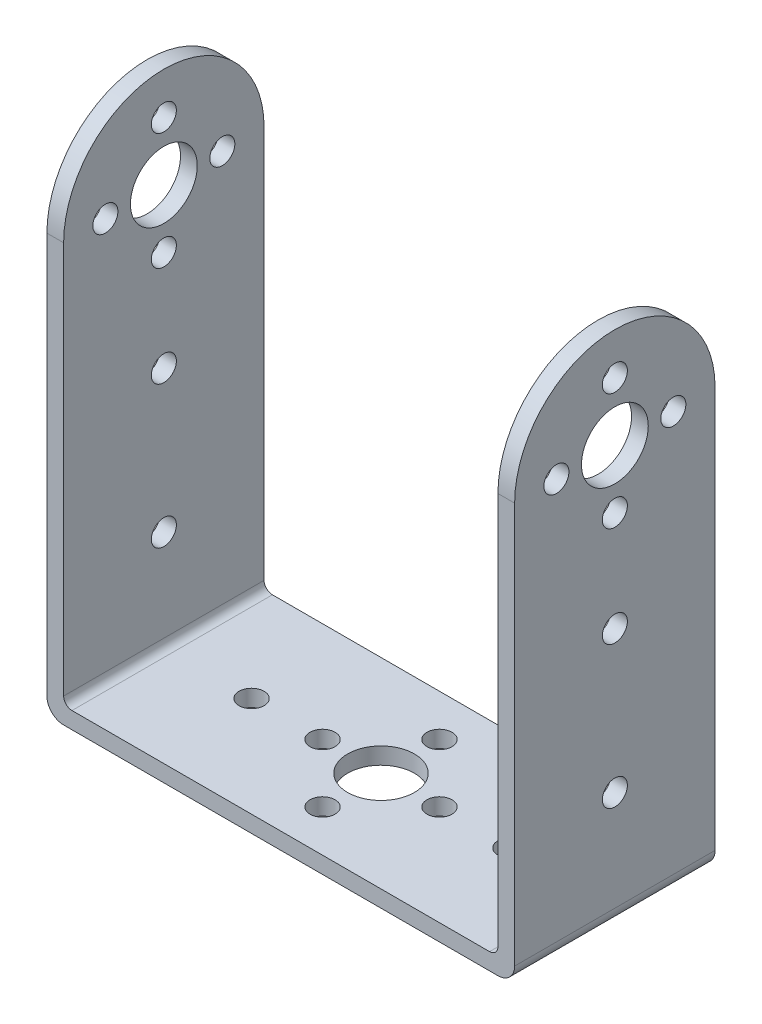
ISO-10303-21;
HEADER;
FILE_DESCRIPTION(('STEP AP214'),'2;1');
FILE_NAME('part.step','',(''),(''),'','','');
FILE_SCHEMA(('AUTOMOTIVE_DESIGN { 1 0 10303 214 1 1 1 1 }'));
ENDSEC;
DATA;
#1=APPLICATION_CONTEXT('core data for automotive mechanical design processes');
#2=APPLICATION_PROTOCOL_DEFINITION('international standard','automotive_design',2000,#1);
#3=PRODUCT_CONTEXT('',#1,'mechanical');
#4=PRODUCT('Part','Part','',(#3));
#5=PRODUCT_RELATED_PRODUCT_CATEGORY('part','',(#4));
#6=PRODUCT_DEFINITION_FORMATION('','',#4);
#7=PRODUCT_DEFINITION_CONTEXT('part definition',#1,'design');
#8=PRODUCT_DEFINITION('design','',#6,#7);
#9=PRODUCT_DEFINITION_SHAPE('','',#8);
#10=(LENGTH_UNIT() NAMED_UNIT(*) SI_UNIT(.MILLI.,.METRE.));
#11=(NAMED_UNIT(*) PLANE_ANGLE_UNIT() SI_UNIT($,.RADIAN.));
#12=(NAMED_UNIT(*) SI_UNIT($,.STERADIAN.) SOLID_ANGLE_UNIT());
#13=UNCERTAINTY_MEASURE_WITH_UNIT(LENGTH_MEASURE(1.E-05),#10,'distance_accuracy_value','');
#14=(GEOMETRIC_REPRESENTATION_CONTEXT(3) GLOBAL_UNCERTAINTY_ASSIGNED_CONTEXT((#13)) GLOBAL_UNIT_ASSIGNED_CONTEXT((#10,
#11,#12)) REPRESENTATION_CONTEXT('',''));
#15=CARTESIAN_POINT('',(0.,0.,0.));
#16=DIRECTION('',(0.,0.,1.));
#17=DIRECTION('',(1.,0.,0.));
#18=AXIS2_PLACEMENT_3D('',#15,#16,#17);
#19=CARTESIAN_POINT('',(0.,2.,0.));
#20=DIRECTION('',(0.,-1.,0.));
#21=DIRECTION('',(0.,0.,-1.));
#22=AXIS2_PLACEMENT_3D('',#19,#20,#21);
#23=PLANE('',#22);
#24=DIRECTION('',(-1.,0.,0.));
#25=VECTOR('',#24,1.);
#26=CARTESIAN_POINT('',(-26.,2.,-12.));
#27=LINE('',#26,#25);
#28=CARTESIAN_POINT('',(25.,2.,-12.));
#29=VERTEX_POINT('',#28);
#30=CARTESIAN_POINT('',(-25.,2.,-12.));
#31=VERTEX_POINT('',#30);
#32=EDGE_CURVE('E263',#29,#31,#27,.T.);
#33=ORIENTED_EDGE('',*,*,#32,.T.);
#34=DIRECTION('',(0.,0.,1.));
#35=VECTOR('',#34,1.);
#36=CARTESIAN_POINT('',(-25.,2.,0.));
#37=LINE('',#36,#35);
#38=CARTESIAN_POINT('',(-25.,2.,12.));
#39=VERTEX_POINT('',#38);
#40=EDGE_CURVE('E299',#31,#39,#37,.T.);
#41=ORIENTED_EDGE('',*,*,#40,.T.);
#42=DIRECTION('',(1.,0.,0.));
#43=VECTOR('',#42,1.);
#44=CARTESIAN_POINT('',(-26.,2.,12.));
#45=LINE('',#44,#43);
#46=CARTESIAN_POINT('',(25.,2.,12.));
#47=VERTEX_POINT('',#46);
#48=EDGE_CURVE('E266',#39,#47,#45,.T.);
#49=ORIENTED_EDGE('',*,*,#48,.T.);
#50=DIRECTION('',(0.,0.,-1.));
#51=VECTOR('',#50,1.);
#52=CARTESIAN_POINT('',(25.,2.,0.));
#53=LINE('',#52,#51);
#54=EDGE_CURVE('E282',#47,#29,#53,.T.);
#55=ORIENTED_EDGE('',*,*,#54,.T.);
#56=EDGE_LOOP('',(#33,#41,#49,#55));
#57=FACE_BOUND('',#56,.T.);
#58=CARTESIAN_POINT('',(0.,2.,0.));
#59=DIRECTION('',(0.,1.,0.));
#60=DIRECTION('',(0.,0.,1.));
#61=AXIS2_PLACEMENT_3D('',#58,#59,#60);
#62=CIRCLE('',#61,4.);
#63=CARTESIAN_POINT('',(0.,2.,4.));
#64=VERTEX_POINT('',#63);
#65=EDGE_CURVE('E257',#64,#64,#62,.T.);
#66=ORIENTED_EDGE('',*,*,#65,.F.);
#67=EDGE_LOOP('',(#66));
#68=FACE_BOUND('',#67,.T.);
#69=CARTESIAN_POINT('',(0.,2.,-7.));
#70=DIRECTION('',(0.,1.,0.));
#71=DIRECTION('',(0.,0.,1.));
#72=AXIS2_PLACEMENT_3D('',#69,#70,#71);
#73=CIRCLE('',#72,1.5);
#74=CARTESIAN_POINT('',(0.,2.,-5.5));
#75=VERTEX_POINT('',#74);
#76=EDGE_CURVE('E251',#75,#75,#73,.T.);
#77=ORIENTED_EDGE('',*,*,#76,.F.);
#78=EDGE_LOOP('',(#77));
#79=FACE_BOUND('',#78,.T.);
#80=CARTESIAN_POINT('',(0.,2.,7.));
#81=DIRECTION('',(0.,1.,0.));
#82=DIRECTION('',(0.,0.,1.));
#83=AXIS2_PLACEMENT_3D('',#80,#81,#82);
#84=CIRCLE('',#83,1.5);
#85=CARTESIAN_POINT('',(0.,2.,8.5));
#86=VERTEX_POINT('',#85);
#87=EDGE_CURVE('E245',#86,#86,#84,.T.);
#88=ORIENTED_EDGE('',*,*,#87,.F.);
#89=EDGE_LOOP('',(#88));
#90=FACE_BOUND('',#89,.T.);
#91=CARTESIAN_POINT('',(7.,2.,0.));
#92=DIRECTION('',(0.,1.,0.));
#93=DIRECTION('',(0.,0.,1.));
#94=AXIS2_PLACEMENT_3D('',#91,#92,#93);
#95=CIRCLE('',#94,1.5);
#96=CARTESIAN_POINT('',(7.,2.,1.5));
#97=VERTEX_POINT('',#96);
#98=EDGE_CURVE('E239',#97,#97,#95,.T.);
#99=ORIENTED_EDGE('',*,*,#98,.F.);
#100=EDGE_LOOP('',(#99));
#101=FACE_BOUND('',#100,.T.);
#102=CARTESIAN_POINT('',(-7.,2.,0.));
#103=DIRECTION('',(0.,1.,0.));
#104=DIRECTION('',(0.,0.,1.));
#105=AXIS2_PLACEMENT_3D('',#102,#103,#104);
#106=CIRCLE('',#105,1.5);
#107=CARTESIAN_POINT('',(-7.,2.,1.5));
#108=VERTEX_POINT('',#107);
#109=EDGE_CURVE('E233',#108,#108,#106,.T.);
#110=ORIENTED_EDGE('',*,*,#109,.F.);
#111=EDGE_LOOP('',(#110));
#112=FACE_BOUND('',#111,.T.);
#113=CARTESIAN_POINT('',(-15.5,2.,0.));
#114=DIRECTION('',(0.,1.,0.));
#115=DIRECTION('',(0.,0.,1.));
#116=AXIS2_PLACEMENT_3D('',#113,#114,#115);
#117=CIRCLE('',#116,1.5);
#118=CARTESIAN_POINT('',(-15.5,2.,1.5));
#119=VERTEX_POINT('',#118);
#120=EDGE_CURVE('E227',#119,#119,#117,.T.);
#121=ORIENTED_EDGE('',*,*,#120,.F.);
#122=EDGE_LOOP('',(#121));
#123=FACE_BOUND('',#122,.T.);
#124=CARTESIAN_POINT('',(15.5,2.,0.));
#125=DIRECTION('',(0.,1.,0.));
#126=DIRECTION('',(0.,0.,1.));
#127=AXIS2_PLACEMENT_3D('',#124,#125,#126);
#128=CIRCLE('',#127,1.5);
#129=CARTESIAN_POINT('',(15.5,2.,1.5));
#130=VERTEX_POINT('',#129);
#131=EDGE_CURVE('E221',#130,#130,#128,.T.);
#132=ORIENTED_EDGE('',*,*,#131,.F.);
#133=EDGE_LOOP('',(#132));
#134=FACE_BOUND('',#133,.T.);
#135=ADVANCED_FACE('F36',(#57,#68,#79,#90,#101,#112,#123,#134),#23,.F.);
#136=CARTESIAN_POINT('',(0.,0.,0.));
#137=DIRECTION('',(0.,-1.,0.));
#138=DIRECTION('',(0.,0.,-1.));
#139=AXIS2_PLACEMENT_3D('',#136,#137,#138);
#140=PLANE('',#139);
#141=CARTESIAN_POINT('',(-15.5,0.,0.));
#142=DIRECTION('',(0.,1.,0.));
#143=DIRECTION('',(0.,0.,1.));
#144=AXIS2_PLACEMENT_3D('',#141,#142,#143);
#145=CIRCLE('',#144,1.5);
#146=CARTESIAN_POINT('',(-15.5,0.,1.5));
#147=VERTEX_POINT('',#146);
#148=EDGE_CURVE('E224',#147,#147,#145,.T.);
#149=ORIENTED_EDGE('',*,*,#148,.T.);
#150=EDGE_LOOP('',(#149));
#151=FACE_BOUND('',#150,.T.);
#152=CARTESIAN_POINT('',(7.,0.,0.));
#153=DIRECTION('',(0.,1.,0.));
#154=DIRECTION('',(0.,0.,1.));
#155=AXIS2_PLACEMENT_3D('',#152,#153,#154);
#156=CIRCLE('',#155,1.5);
#157=CARTESIAN_POINT('',(7.,0.,1.5));
#158=VERTEX_POINT('',#157);
#159=EDGE_CURVE('E236',#158,#158,#156,.T.);
#160=ORIENTED_EDGE('',*,*,#159,.T.);
#161=EDGE_LOOP('',(#160));
#162=FACE_BOUND('',#161,.T.);
#163=CARTESIAN_POINT('',(0.,0.,-7.));
#164=DIRECTION('',(0.,1.,0.));
#165=DIRECTION('',(0.,0.,1.));
#166=AXIS2_PLACEMENT_3D('',#163,#164,#165);
#167=CIRCLE('',#166,1.5);
#168=CARTESIAN_POINT('',(0.,0.,-5.5));
#169=VERTEX_POINT('',#168);
#170=EDGE_CURVE('E248',#169,#169,#167,.T.);
#171=ORIENTED_EDGE('',*,*,#170,.T.);
#172=EDGE_LOOP('',(#171));
#173=FACE_BOUND('',#172,.T.);
#174=DIRECTION('',(1.,0.,0.));
#175=VECTOR('',#174,1.);
#176=CARTESIAN_POINT('',(-26.,0.,12.));
#177=LINE('',#176,#175);
#178=CARTESIAN_POINT('',(-26.,0.,12.));
#179=VERTEX_POINT('',#178);
#180=CARTESIAN_POINT('',(26.,0.,12.));
#181=VERTEX_POINT('',#180);
#182=EDGE_CURVE('E267',#179,#181,#177,.T.);
#183=ORIENTED_EDGE('',*,*,#182,.F.);
#184=DIRECTION('',(0.,0.,1.));
#185=VECTOR('',#184,1.);
#186=CARTESIAN_POINT('',(-26.,0.,-12.));
#187=LINE('',#186,#185);
#188=CARTESIAN_POINT('',(-26.,0.,-12.));
#189=VERTEX_POINT('',#188);
#190=EDGE_CURVE('E295',#179,#189,#187,.F.);
#191=ORIENTED_EDGE('',*,*,#190,.T.);
#192=DIRECTION('',(-1.,0.,0.));
#193=VECTOR('',#192,1.);
#194=CARTESIAN_POINT('',(-26.,0.,-12.));
#195=LINE('',#194,#193);
#196=CARTESIAN_POINT('',(26.,0.,-12.));
#197=VERTEX_POINT('',#196);
#198=EDGE_CURVE('E260',#197,#189,#195,.T.);
#199=ORIENTED_EDGE('',*,*,#198,.F.);
#200=DIRECTION('',(0.,0.,-1.));
#201=VECTOR('',#200,1.);
#202=CARTESIAN_POINT('',(26.,0.,12.));
#203=LINE('',#202,#201);
#204=EDGE_CURVE('E277',#197,#181,#203,.F.);
#205=ORIENTED_EDGE('',*,*,#204,.T.);
#206=EDGE_LOOP('',(#183,#191,#199,#205));
#207=FACE_BOUND('',#206,.T.);
#208=CARTESIAN_POINT('',(0.,0.,0.));
#209=DIRECTION('',(0.,1.,0.));
#210=DIRECTION('',(0.,0.,1.));
#211=AXIS2_PLACEMENT_3D('',#208,#209,#210);
#212=CIRCLE('',#211,4.);
#213=CARTESIAN_POINT('',(0.,0.,4.));
#214=VERTEX_POINT('',#213);
#215=EDGE_CURVE('E254',#214,#214,#212,.T.);
#216=ORIENTED_EDGE('',*,*,#215,.T.);
#217=EDGE_LOOP('',(#216));
#218=FACE_BOUND('',#217,.T.);
#219=CARTESIAN_POINT('',(0.,0.,7.));
#220=DIRECTION('',(0.,1.,0.));
#221=DIRECTION('',(0.,0.,1.));
#222=AXIS2_PLACEMENT_3D('',#219,#220,#221);
#223=CIRCLE('',#222,1.5);
#224=CARTESIAN_POINT('',(0.,0.,8.5));
#225=VERTEX_POINT('',#224);
#226=EDGE_CURVE('E242',#225,#225,#223,.T.);
#227=ORIENTED_EDGE('',*,*,#226,.T.);
#228=EDGE_LOOP('',(#227));
#229=FACE_BOUND('',#228,.T.);
#230=CARTESIAN_POINT('',(-7.,0.,0.));
#231=DIRECTION('',(0.,1.,0.));
#232=DIRECTION('',(0.,0.,1.));
#233=AXIS2_PLACEMENT_3D('',#230,#231,#232);
#234=CIRCLE('',#233,1.5);
#235=CARTESIAN_POINT('',(-7.,0.,1.5));
#236=VERTEX_POINT('',#235);
#237=EDGE_CURVE('E230',#236,#236,#234,.T.);
#238=ORIENTED_EDGE('',*,*,#237,.T.);
#239=EDGE_LOOP('',(#238));
#240=FACE_BOUND('',#239,.T.);
#241=CARTESIAN_POINT('',(15.5,0.,0.));
#242=DIRECTION('',(0.,1.,0.));
#243=DIRECTION('',(0.,0.,1.));
#244=AXIS2_PLACEMENT_3D('',#241,#242,#243);
#245=CIRCLE('',#244,1.5);
#246=CARTESIAN_POINT('',(15.5,0.,1.5));
#247=VERTEX_POINT('',#246);
#248=EDGE_CURVE('E220',#247,#247,#245,.T.);
#249=ORIENTED_EDGE('',*,*,#248,.T.);
#250=EDGE_LOOP('',(#249));
#251=FACE_BOUND('',#250,.T.);
#252=ADVANCED_FACE('F325',(#151,#162,#173,#207,#218,#229,#240,#251),#140,.T.);
#253=CARTESIAN_POINT('',(-26.,2.,-12.));
#254=DIRECTION('',(0.,0.,1.));
#255=DIRECTION('',(1.,0.,0.));
#256=AXIS2_PLACEMENT_3D('',#253,#254,#255);
#257=PLANE('',#256);
#258=ORIENTED_EDGE('',*,*,#198,.T.);
#259=CARTESIAN_POINT('',(-26.,2.,-12.));
#260=DIRECTION('',(0.,0.,1.));
#261=DIRECTION('',(1.,0.,0.));
#262=AXIS2_PLACEMENT_3D('',#259,#260,#261);
#263=CIRCLE('',#262,2.);
#264=CARTESIAN_POINT('',(-28.,2.,-12.));
#265=VERTEX_POINT('',#264);
#266=EDGE_CURVE('E297',#189,#265,#263,.F.);
#267=ORIENTED_EDGE('',*,*,#266,.T.);
#268=DIRECTION('',(0.,-1.,0.));
#269=VECTOR('',#268,1.);
#270=CARTESIAN_POINT('',(-28.,0.,-12.));
#271=LINE('',#270,#269);
#272=CARTESIAN_POINT('',(-28.,49.9999999999999,-12.));
#273=VERTEX_POINT('',#272);
#274=EDGE_CURVE('E148',#273,#265,#271,.T.);
#275=ORIENTED_EDGE('',*,*,#274,.F.);
#276=DIRECTION('',(1.,0.,0.));
#277=VECTOR('',#276,1.);
#278=CARTESIAN_POINT('',(-28.,49.9999999999999,-12.));
#279=LINE('',#278,#277);
#280=CARTESIAN_POINT('',(-26.,49.9999999999999,-12.));
#281=VERTEX_POINT('',#280);
#282=EDGE_CURVE('E143',#273,#281,#279,.T.);
#283=ORIENTED_EDGE('',*,*,#282,.T.);
#284=DIRECTION('',(0.,-1.,0.));
#285=VECTOR('',#284,1.);
#286=CARTESIAN_POINT('',(-26.,0.,-12.));
#287=LINE('',#286,#285);
#288=CARTESIAN_POINT('',(-26.,3.,-12.));
#289=VERTEX_POINT('',#288);
#290=EDGE_CURVE('E134',#281,#289,#287,.T.);
#291=ORIENTED_EDGE('',*,*,#290,.T.);
#292=CARTESIAN_POINT('',(-25.,3.,-12.));
#293=DIRECTION('',(0.,0.,1.));
#294=DIRECTION('',(1.,0.,0.));
#295=AXIS2_PLACEMENT_3D('',#292,#293,#294);
#296=CIRCLE('',#295,1.);
#297=EDGE_CURVE('E11',#289,#31,#296,.T.);
#298=ORIENTED_EDGE('',*,*,#297,.T.);
#299=ORIENTED_EDGE('',*,*,#32,.F.);
#300=CARTESIAN_POINT('',(25.,3.,-12.));
#301=DIRECTION('',(0.,0.,1.));
#302=DIRECTION('',(1.,0.,0.));
#303=AXIS2_PLACEMENT_3D('',#300,#301,#302);
#304=CIRCLE('',#303,1.);
#305=CARTESIAN_POINT('',(26.,3.,-12.));
#306=VERTEX_POINT('',#305);
#307=EDGE_CURVE('E287',#29,#306,#304,.T.);
#308=ORIENTED_EDGE('',*,*,#307,.T.);
#309=DIRECTION('',(0.,1.,0.));
#310=VECTOR('',#309,1.);
#311=CARTESIAN_POINT('',(26.,0.,-12.));
#312=LINE('',#311,#310);
#313=CARTESIAN_POINT('',(26.,50.,-12.));
#314=VERTEX_POINT('',#313);
#315=EDGE_CURVE('E212',#306,#314,#312,.T.);
#316=ORIENTED_EDGE('',*,*,#315,.T.);
#317=DIRECTION('',(-1.,0.,0.));
#318=VECTOR('',#317,1.);
#319=CARTESIAN_POINT('',(28.,50.,-12.));
#320=LINE('',#319,#318);
#321=CARTESIAN_POINT('',(28.,50.,-12.));
#322=VERTEX_POINT('',#321);
#323=EDGE_CURVE('E217',#322,#314,#320,.T.);
#324=ORIENTED_EDGE('',*,*,#323,.F.);
#325=DIRECTION('',(0.,1.,0.));
#326=VECTOR('',#325,1.);
#327=CARTESIAN_POINT('',(28.,0.,-12.));
#328=LINE('',#327,#326);
#329=CARTESIAN_POINT('',(28.,2.,-12.));
#330=VERTEX_POINT('',#329);
#331=EDGE_CURVE('E204',#330,#322,#328,.T.);
#332=ORIENTED_EDGE('',*,*,#331,.F.);
#333=CARTESIAN_POINT('',(26.,2.,-12.));
#334=DIRECTION('',(0.,0.,1.));
#335=DIRECTION('',(1.,0.,0.));
#336=AXIS2_PLACEMENT_3D('',#333,#334,#335);
#337=CIRCLE('',#336,2.);
#338=EDGE_CURVE('E275',#330,#197,#337,.F.);
#339=ORIENTED_EDGE('',*,*,#338,.T.);
#340=EDGE_LOOP('',(#258,#267,#275,#283,#291,#298,#299,#308,#316,#324,#332,#339));
#341=FACE_BOUND('',#340,.T.);
#342=ADVANCED_FACE('F315',(#341),#257,.F.);
#343=CARTESIAN_POINT('',(-26.,2.,12.));
#344=DIRECTION('',(0.,0.,-1.));
#345=DIRECTION('',(-1.,0.,0.));
#346=AXIS2_PLACEMENT_3D('',#343,#344,#345);
#347=PLANE('',#346);
#348=DIRECTION('',(0.,1.,0.));
#349=VECTOR('',#348,1.);
#350=CARTESIAN_POINT('',(-28.,50.,12.));
#351=LINE('',#350,#349);
#352=CARTESIAN_POINT('',(-28.,2.00000000000002,12.));
#353=VERTEX_POINT('',#352);
#354=CARTESIAN_POINT('',(-28.,50.,12.));
#355=VERTEX_POINT('',#354);
#356=EDGE_CURVE('E124',#353,#355,#351,.T.);
#357=ORIENTED_EDGE('',*,*,#356,.F.);
#358=CARTESIAN_POINT('',(-26.,2.,12.));
#359=DIRECTION('',(0.,0.,-1.));
#360=DIRECTION('',(-1.,0.,0.));
#361=AXIS2_PLACEMENT_3D('',#358,#359,#360);
#362=CIRCLE('',#361,2.);
#363=EDGE_CURVE('E293',#353,#179,#362,.F.);
#364=ORIENTED_EDGE('',*,*,#363,.T.);
#365=ORIENTED_EDGE('',*,*,#182,.T.);
#366=CARTESIAN_POINT('',(26.,2.,12.));
#367=DIRECTION('',(0.,0.,-1.));
#368=DIRECTION('',(-1.,0.,0.));
#369=AXIS2_PLACEMENT_3D('',#366,#367,#368);
#370=CIRCLE('',#369,2.);
#371=CARTESIAN_POINT('',(28.,2.,12.));
#372=VERTEX_POINT('',#371);
#373=EDGE_CURVE('E280',#181,#372,#370,.F.);
#374=ORIENTED_EDGE('',*,*,#373,.T.);
#375=DIRECTION('',(0.,-1.,0.));
#376=VECTOR('',#375,1.);
#377=CARTESIAN_POINT('',(28.,0.,12.));
#378=LINE('',#377,#376);
#379=CARTESIAN_POINT('',(28.,50.,12.));
#380=VERTEX_POINT('',#379);
#381=EDGE_CURVE('E201',#380,#372,#378,.T.);
#382=ORIENTED_EDGE('',*,*,#381,.F.);
#383=DIRECTION('',(-1.,0.,0.));
#384=VECTOR('',#383,1.);
#385=CARTESIAN_POINT('',(28.,50.,12.));
#386=LINE('',#385,#384);
#387=CARTESIAN_POINT('',(26.,50.,12.));
#388=VERTEX_POINT('',#387);
#389=EDGE_CURVE('E209',#380,#388,#386,.T.);
#390=ORIENTED_EDGE('',*,*,#389,.T.);
#391=DIRECTION('',(0.,-1.,0.));
#392=VECTOR('',#391,1.);
#393=CARTESIAN_POINT('',(26.,0.,12.));
#394=LINE('',#393,#392);
#395=CARTESIAN_POINT('',(26.,3.,12.));
#396=VERTEX_POINT('',#395);
#397=EDGE_CURVE('E198',#388,#396,#394,.T.);
#398=ORIENTED_EDGE('',*,*,#397,.T.);
#399=CARTESIAN_POINT('',(25.,3.,12.));
#400=DIRECTION('',(0.,0.,-1.));
#401=DIRECTION('',(-1.,0.,0.));
#402=AXIS2_PLACEMENT_3D('',#399,#400,#401);
#403=CIRCLE('',#402,1.);
#404=EDGE_CURVE('E289',#396,#47,#403,.T.);
#405=ORIENTED_EDGE('',*,*,#404,.T.);
#406=ORIENTED_EDGE('',*,*,#48,.F.);
#407=CARTESIAN_POINT('',(-25.,3.,12.));
#408=DIRECTION('',(0.,0.,-1.));
#409=DIRECTION('',(-1.,0.,0.));
#410=AXIS2_PLACEMENT_3D('',#407,#408,#409);
#411=CIRCLE('',#410,1.);
#412=CARTESIAN_POINT('',(-26.,3.00000000000002,12.));
#413=VERTEX_POINT('',#412);
#414=EDGE_CURVE('E44',#39,#413,#411,.T.);
#415=ORIENTED_EDGE('',*,*,#414,.T.);
#416=DIRECTION('',(0.,1.,0.));
#417=VECTOR('',#416,1.);
#418=CARTESIAN_POINT('',(-26.,50.,12.));
#419=LINE('',#418,#417);
#420=CARTESIAN_POINT('',(-26.,50.,12.));
#421=VERTEX_POINT('',#420);
#422=EDGE_CURVE('E139',#413,#421,#419,.T.);
#423=ORIENTED_EDGE('',*,*,#422,.T.);
#424=DIRECTION('',(1.,0.,0.));
#425=VECTOR('',#424,1.);
#426=CARTESIAN_POINT('',(-28.,50.,12.));
#427=LINE('',#426,#425);
#428=EDGE_CURVE('E137',#355,#421,#427,.T.);
#429=ORIENTED_EDGE('',*,*,#428,.F.);
#430=EDGE_LOOP('',(#357,#364,#365,#374,#382,#390,#398,#405,#406,#415,#423,#429));
#431=FACE_BOUND('',#430,.T.);
#432=ADVANCED_FACE('F138',(#431),#347,.F.);
#433=CARTESIAN_POINT('',(0.,2.,0.));
#434=DIRECTION('',(0.,-1.,0.));
#435=DIRECTION('',(0.,0.,-1.));
#436=AXIS2_PLACEMENT_3D('',#433,#434,#435);
#437=CYLINDRICAL_SURFACE('',#436,4.);
#438=ORIENTED_EDGE('',*,*,#65,.T.);
#439=EDGE_LOOP('',(#438));
#440=FACE_BOUND('',#439,.T.);
#441=ORIENTED_EDGE('',*,*,#215,.F.);
#442=EDGE_LOOP('',(#441));
#443=FACE_BOUND('',#442,.T.);
#444=ADVANCED_FACE('F333',(#440,#443),#437,.F.);
#445=CARTESIAN_POINT('',(0.,2.,-7.));
#446=DIRECTION('',(0.,-1.,0.));
#447=DIRECTION('',(0.,0.,-1.));
#448=AXIS2_PLACEMENT_3D('',#445,#446,#447);
#449=CYLINDRICAL_SURFACE('',#448,1.5);
#450=ORIENTED_EDGE('',*,*,#76,.T.);
#451=EDGE_LOOP('',(#450));
#452=FACE_BOUND('',#451,.T.);
#453=ORIENTED_EDGE('',*,*,#170,.F.);
#454=EDGE_LOOP('',(#453));
#455=FACE_BOUND('',#454,.T.);
#456=ADVANCED_FACE('F420',(#452,#455),#449,.F.);
#457=CARTESIAN_POINT('',(0.,2.,7.));
#458=DIRECTION('',(0.,-1.,0.));
#459=DIRECTION('',(0.,0.,-1.));
#460=AXIS2_PLACEMENT_3D('',#457,#458,#459);
#461=CYLINDRICAL_SURFACE('',#460,1.5);
#462=ORIENTED_EDGE('',*,*,#87,.T.);
#463=EDGE_LOOP('',(#462));
#464=FACE_BOUND('',#463,.T.);
#465=ORIENTED_EDGE('',*,*,#226,.F.);
#466=EDGE_LOOP('',(#465));
#467=FACE_BOUND('',#466,.T.);
#468=ADVANCED_FACE('F417',(#464,#467),#461,.F.);
#469=CARTESIAN_POINT('',(7.,2.,0.));
#470=DIRECTION('',(0.,-1.,0.));
#471=DIRECTION('',(0.,0.,-1.));
#472=AXIS2_PLACEMENT_3D('',#469,#470,#471);
#473=CYLINDRICAL_SURFACE('',#472,1.5);
#474=ORIENTED_EDGE('',*,*,#98,.T.);
#475=EDGE_LOOP('',(#474));
#476=FACE_BOUND('',#475,.T.);
#477=ORIENTED_EDGE('',*,*,#159,.F.);
#478=EDGE_LOOP('',(#477));
#479=FACE_BOUND('',#478,.T.);
#480=ADVANCED_FACE('F413',(#476,#479),#473,.F.);
#481=CARTESIAN_POINT('',(-7.,2.,0.));
#482=DIRECTION('',(0.,-1.,0.));
#483=DIRECTION('',(0.,0.,-1.));
#484=AXIS2_PLACEMENT_3D('',#481,#482,#483);
#485=CYLINDRICAL_SURFACE('',#484,1.5);
#486=ORIENTED_EDGE('',*,*,#109,.T.);
#487=EDGE_LOOP('',(#486));
#488=FACE_BOUND('',#487,.T.);
#489=ORIENTED_EDGE('',*,*,#237,.F.);
#490=EDGE_LOOP('',(#489));
#491=FACE_BOUND('',#490,.T.);
#492=ADVANCED_FACE('F409',(#488,#491),#485,.F.);
#493=CARTESIAN_POINT('',(-15.5,2.,0.));
#494=DIRECTION('',(0.,-1.,0.));
#495=DIRECTION('',(0.,0.,-1.));
#496=AXIS2_PLACEMENT_3D('',#493,#494,#495);
#497=CYLINDRICAL_SURFACE('',#496,1.5);
#498=ORIENTED_EDGE('',*,*,#120,.T.);
#499=EDGE_LOOP('',(#498));
#500=FACE_BOUND('',#499,.T.);
#501=ORIENTED_EDGE('',*,*,#148,.F.);
#502=EDGE_LOOP('',(#501));
#503=FACE_BOUND('',#502,.T.);
#504=ADVANCED_FACE('F405',(#500,#503),#497,.F.);
#505=CARTESIAN_POINT('',(15.5,2.,0.));
#506=DIRECTION('',(0.,-1.,0.));
#507=DIRECTION('',(0.,0.,-1.));
#508=AXIS2_PLACEMENT_3D('',#505,#506,#507);
#509=CYLINDRICAL_SURFACE('',#508,1.5);
#510=ORIENTED_EDGE('',*,*,#131,.T.);
#511=EDGE_LOOP('',(#510));
#512=FACE_BOUND('',#511,.T.);
#513=ORIENTED_EDGE('',*,*,#248,.F.);
#514=EDGE_LOOP('',(#513));
#515=FACE_BOUND('',#514,.T.);
#516=ADVANCED_FACE('F398',(#512,#515),#509,.F.);
#517=CARTESIAN_POINT('',(26.,50.,0.));
#518=DIRECTION('',(-1.,0.,0.));
#519=DIRECTION('',(0.,0.,1.));
#520=AXIS2_PLACEMENT_3D('',#517,#518,#519);
#521=PLANE('',#520);
#522=CARTESIAN_POINT('',(26.,14.,0.));
#523=DIRECTION('',(1.,0.,0.));
#524=DIRECTION('',(0.,0.,-1.));
#525=AXIS2_PLACEMENT_3D('',#522,#523,#524);
#526=CIRCLE('',#525,1.5);
#527=CARTESIAN_POINT('',(26.,14.,-1.5));
#528=VERTEX_POINT('',#527);
#529=EDGE_CURVE('E142',#528,#528,#526,.T.);
#530=ORIENTED_EDGE('',*,*,#529,.T.);
#531=EDGE_LOOP('',(#530));
#532=FACE_BOUND('',#531,.T.);
#533=CARTESIAN_POINT('',(26.,50.,7.00000000000001));
#534=DIRECTION('',(1.,0.,0.));
#535=DIRECTION('',(0.,0.,-1.));
#536=AXIS2_PLACEMENT_3D('',#533,#534,#535);
#537=CIRCLE('',#536,1.5);
#538=CARTESIAN_POINT('',(26.,50.,5.50000000000001));
#539=VERTEX_POINT('',#538);
#540=EDGE_CURVE('E168',#539,#539,#537,.T.);
#541=ORIENTED_EDGE('',*,*,#540,.T.);
#542=EDGE_LOOP('',(#541));
#543=FACE_BOUND('',#542,.T.);
#544=CARTESIAN_POINT('',(26.,50.,-6.99999999999999));
#545=DIRECTION('',(1.,0.,0.));
#546=DIRECTION('',(0.,0.,-1.));
#547=AXIS2_PLACEMENT_3D('',#544,#545,#546);
#548=CIRCLE('',#547,1.5);
#549=CARTESIAN_POINT('',(26.,50.,-8.49999999999999));
#550=VERTEX_POINT('',#549);
#551=EDGE_CURVE('E180',#550,#550,#548,.T.);
#552=ORIENTED_EDGE('',*,*,#551,.T.);
#553=EDGE_LOOP('',(#552));
#554=FACE_BOUND('',#553,.T.);
#555=CARTESIAN_POINT('',(26.,50.,0.));
#556=DIRECTION('',(1.,0.,0.));
#557=DIRECTION('',(0.,0.,-1.));
#558=AXIS2_PLACEMENT_3D('',#555,#556,#557);
#559=CIRCLE('',#558,4.);
#560=CARTESIAN_POINT('',(26.,50.,-3.99999999999999));
#561=VERTEX_POINT('',#560);
#562=EDGE_CURVE('E192',#561,#561,#559,.T.);
#563=ORIENTED_EDGE('',*,*,#562,.T.);
#564=EDGE_LOOP('',(#563));
#565=FACE_BOUND('',#564,.T.);
#566=CARTESIAN_POINT('',(26.,57.,0.));
#567=DIRECTION('',(1.,0.,0.));
#568=DIRECTION('',(0.,0.,-1.));
#569=AXIS2_PLACEMENT_3D('',#566,#567,#568);
#570=CIRCLE('',#569,1.5);
#571=CARTESIAN_POINT('',(26.,57.,-1.49999999999999));
#572=VERTEX_POINT('',#571);
#573=EDGE_CURVE('E186',#572,#572,#570,.T.);
#574=ORIENTED_EDGE('',*,*,#573,.T.);
#575=EDGE_LOOP('',(#574));
#576=FACE_BOUND('',#575,.T.);
#577=CARTESIAN_POINT('',(26.,43.,0.));
#578=DIRECTION('',(1.,0.,0.));
#579=DIRECTION('',(0.,0.,-1.));
#580=AXIS2_PLACEMENT_3D('',#577,#578,#579);
#581=CIRCLE('',#580,1.5);
#582=CARTESIAN_POINT('',(26.,43.,-1.49999999999999));
#583=VERTEX_POINT('',#582);
#584=EDGE_CURVE('E174',#583,#583,#581,.T.);
#585=ORIENTED_EDGE('',*,*,#584,.T.);
#586=EDGE_LOOP('',(#585));
#587=FACE_BOUND('',#586,.T.);
#588=CARTESIAN_POINT('',(26.,31.,0.));
#589=DIRECTION('',(1.,0.,0.));
#590=DIRECTION('',(0.,0.,-1.));
#591=AXIS2_PLACEMENT_3D('',#588,#589,#590);
#592=CIRCLE('',#591,1.5);
#593=CARTESIAN_POINT('',(26.,31.,-1.49999999999999));
#594=VERTEX_POINT('',#593);
#595=EDGE_CURVE('E162',#594,#594,#592,.T.);
#596=ORIENTED_EDGE('',*,*,#595,.T.);
#597=EDGE_LOOP('',(#596));
#598=FACE_BOUND('',#597,.T.);
#599=ORIENTED_EDGE('',*,*,#315,.F.);
#600=DIRECTION('',(0.,0.,-1.));
#601=VECTOR('',#600,1.);
#602=CARTESIAN_POINT('',(26.,3.,0.));
#603=LINE('',#602,#601);
#604=EDGE_CURVE('E285',#306,#396,#603,.F.);
#605=ORIENTED_EDGE('',*,*,#604,.T.);
#606=ORIENTED_EDGE('',*,*,#397,.F.);
#607=CARTESIAN_POINT('',(26.,50.,0.));
#608=DIRECTION('',(1.,0.,0.));
#609=DIRECTION('',(0.,0.,1.));
#610=AXIS2_PLACEMENT_3D('',#607,#608,#609);
#611=CIRCLE('',#610,12.);
#612=EDGE_CURVE('E205',#314,#388,#611,.T.);
#613=ORIENTED_EDGE('',*,*,#612,.F.);
#614=EDGE_LOOP('',(#599,#605,#606,#613));
#615=FACE_BOUND('',#614,.T.);
#616=ADVANCED_FACE('F394',(#532,#543,#554,#565,#576,#587,#598,#615),#521,.T.);
#617=CARTESIAN_POINT('',(28.,50.,0.));
#618=DIRECTION('',(-1.,0.,0.));
#619=DIRECTION('',(0.,0.,1.));
#620=AXIS2_PLACEMENT_3D('',#617,#618,#619);
#621=PLANE('',#620);
#622=ORIENTED_EDGE('',*,*,#381,.T.);
#623=DIRECTION('',(0.,0.,-1.));
#624=VECTOR('',#623,1.);
#625=CARTESIAN_POINT('',(28.,2.,-12.));
#626=LINE('',#625,#624);
#627=EDGE_CURVE('E269',#372,#330,#626,.T.);
#628=ORIENTED_EDGE('',*,*,#627,.T.);
#629=ORIENTED_EDGE('',*,*,#331,.T.);
#630=CARTESIAN_POINT('',(28.,50.,0.));
#631=DIRECTION('',(1.,0.,0.));
#632=DIRECTION('',(0.,0.,1.));
#633=AXIS2_PLACEMENT_3D('',#630,#631,#632);
#634=CIRCLE('',#633,12.);
#635=EDGE_CURVE('E207',#322,#380,#634,.T.);
#636=ORIENTED_EDGE('',*,*,#635,.T.);
#637=EDGE_LOOP('',(#622,#628,#629,#636));
#638=FACE_BOUND('',#637,.T.);
#639=CARTESIAN_POINT('',(28.,50.,0.));
#640=DIRECTION('',(1.,0.,0.));
#641=DIRECTION('',(0.,0.,-1.));
#642=AXIS2_PLACEMENT_3D('',#639,#640,#641);
#643=CIRCLE('',#642,4.);
#644=CARTESIAN_POINT('',(28.,50.,-3.99999999999999));
#645=VERTEX_POINT('',#644);
#646=EDGE_CURVE('E195',#645,#645,#643,.T.);
#647=ORIENTED_EDGE('',*,*,#646,.F.);
#648=EDGE_LOOP('',(#647));
#649=FACE_BOUND('',#648,.T.);
#650=CARTESIAN_POINT('',(28.,57.,0.));
#651=DIRECTION('',(1.,0.,0.));
#652=DIRECTION('',(0.,0.,-1.));
#653=AXIS2_PLACEMENT_3D('',#650,#651,#652);
#654=CIRCLE('',#653,1.5);
#655=CARTESIAN_POINT('',(28.,57.,-1.49999999999999));
#656=VERTEX_POINT('',#655);
#657=EDGE_CURVE('E189',#656,#656,#654,.T.);
#658=ORIENTED_EDGE('',*,*,#657,.F.);
#659=EDGE_LOOP('',(#658));
#660=FACE_BOUND('',#659,.T.);
#661=CARTESIAN_POINT('',(28.,50.,-6.99999999999999));
#662=DIRECTION('',(1.,0.,0.));
#663=DIRECTION('',(0.,0.,-1.));
#664=AXIS2_PLACEMENT_3D('',#661,#662,#663);
#665=CIRCLE('',#664,1.5);
#666=CARTESIAN_POINT('',(28.,50.,-8.49999999999999));
#667=VERTEX_POINT('',#666);
#668=EDGE_CURVE('E183',#667,#667,#665,.T.);
#669=ORIENTED_EDGE('',*,*,#668,.F.);
#670=EDGE_LOOP('',(#669));
#671=FACE_BOUND('',#670,.T.);
#672=CARTESIAN_POINT('',(28.,43.,0.));
#673=DIRECTION('',(1.,0.,0.));
#674=DIRECTION('',(0.,0.,-1.));
#675=AXIS2_PLACEMENT_3D('',#672,#673,#674);
#676=CIRCLE('',#675,1.5);
#677=CARTESIAN_POINT('',(28.,43.,-1.49999999999999));
#678=VERTEX_POINT('',#677);
#679=EDGE_CURVE('E177',#678,#678,#676,.T.);
#680=ORIENTED_EDGE('',*,*,#679,.F.);
#681=EDGE_LOOP('',(#680));
#682=FACE_BOUND('',#681,.T.);
#683=CARTESIAN_POINT('',(28.,50.,7.00000000000001));
#684=DIRECTION('',(1.,0.,0.));
#685=DIRECTION('',(0.,0.,-1.));
#686=AXIS2_PLACEMENT_3D('',#683,#684,#685);
#687=CIRCLE('',#686,1.5);
#688=CARTESIAN_POINT('',(28.,50.,5.50000000000001));
#689=VERTEX_POINT('',#688);
#690=EDGE_CURVE('E171',#689,#689,#687,.T.);
#691=ORIENTED_EDGE('',*,*,#690,.F.);
#692=EDGE_LOOP('',(#691));
#693=FACE_BOUND('',#692,.T.);
#694=CARTESIAN_POINT('',(28.,31.,0.));
#695=DIRECTION('',(1.,0.,0.));
#696=DIRECTION('',(0.,0.,-1.));
#697=AXIS2_PLACEMENT_3D('',#694,#695,#696);
#698=CIRCLE('',#697,1.5);
#699=CARTESIAN_POINT('',(28.,31.,-1.49999999999999));
#700=VERTEX_POINT('',#699);
#701=EDGE_CURVE('E165',#700,#700,#698,.T.);
#702=ORIENTED_EDGE('',*,*,#701,.F.);
#703=EDGE_LOOP('',(#702));
#704=FACE_BOUND('',#703,.T.);
#705=CARTESIAN_POINT('',(28.,14.,0.));
#706=DIRECTION('',(1.,0.,0.));
#707=DIRECTION('',(0.,0.,-1.));
#708=AXIS2_PLACEMENT_3D('',#705,#706,#707);
#709=CIRCLE('',#708,1.5);
#710=CARTESIAN_POINT('',(28.,14.,-1.5));
#711=VERTEX_POINT('',#710);
#712=EDGE_CURVE('E159',#711,#711,#709,.T.);
#713=ORIENTED_EDGE('',*,*,#712,.F.);
#714=EDGE_LOOP('',(#713));
#715=FACE_BOUND('',#714,.T.);
#716=ADVANCED_FACE('F391',(#638,#649,#660,#671,#682,#693,#704,#715),#621,.F.);
#717=CARTESIAN_POINT('',(28.,50.,0.));
#718=DIRECTION('',(-1.,0.,0.));
#719=DIRECTION('',(0.,0.,1.));
#720=AXIS2_PLACEMENT_3D('',#717,#718,#719);
#721=CYLINDRICAL_SURFACE('',#720,12.);
#722=ORIENTED_EDGE('',*,*,#612,.T.);
#723=ORIENTED_EDGE('',*,*,#389,.F.);
#724=ORIENTED_EDGE('',*,*,#635,.F.);
#725=ORIENTED_EDGE('',*,*,#323,.T.);
#726=EDGE_LOOP('',(#722,#723,#724,#725));
#727=FACE_BOUND('',#726,.T.);
#728=ADVANCED_FACE('F389',(#727),#721,.T.);
#729=CARTESIAN_POINT('',(28.,50.,0.));
#730=DIRECTION('',(-1.,0.,0.));
#731=DIRECTION('',(0.,0.,1.));
#732=AXIS2_PLACEMENT_3D('',#729,#730,#731);
#733=CYLINDRICAL_SURFACE('',#732,4.);
#734=ORIENTED_EDGE('',*,*,#646,.T.);
#735=EDGE_LOOP('',(#734));
#736=FACE_BOUND('',#735,.T.);
#737=ORIENTED_EDGE('',*,*,#562,.F.);
#738=EDGE_LOOP('',(#737));
#739=FACE_BOUND('',#738,.T.);
#740=ADVANCED_FACE('F385',(#736,#739),#733,.F.);
#741=CARTESIAN_POINT('',(28.,57.,0.));
#742=DIRECTION('',(-1.,0.,0.));
#743=DIRECTION('',(0.,0.,1.));
#744=AXIS2_PLACEMENT_3D('',#741,#742,#743);
#745=CYLINDRICAL_SURFACE('',#744,1.5);
#746=ORIENTED_EDGE('',*,*,#657,.T.);
#747=EDGE_LOOP('',(#746));
#748=FACE_BOUND('',#747,.T.);
#749=ORIENTED_EDGE('',*,*,#573,.F.);
#750=EDGE_LOOP('',(#749));
#751=FACE_BOUND('',#750,.T.);
#752=ADVANCED_FACE('F381',(#748,#751),#745,.F.);
#753=CARTESIAN_POINT('',(28.,50.,-6.99999999999999));
#754=DIRECTION('',(-1.,0.,0.));
#755=DIRECTION('',(0.,0.,1.));
#756=AXIS2_PLACEMENT_3D('',#753,#754,#755);
#757=CYLINDRICAL_SURFACE('',#756,1.5);
#758=ORIENTED_EDGE('',*,*,#668,.T.);
#759=EDGE_LOOP('',(#758));
#760=FACE_BOUND('',#759,.T.);
#761=ORIENTED_EDGE('',*,*,#551,.F.);
#762=EDGE_LOOP('',(#761));
#763=FACE_BOUND('',#762,.T.);
#764=ADVANCED_FACE('F377',(#760,#763),#757,.F.);
#765=CARTESIAN_POINT('',(28.,43.,0.));
#766=DIRECTION('',(-1.,0.,0.));
#767=DIRECTION('',(0.,0.,1.));
#768=AXIS2_PLACEMENT_3D('',#765,#766,#767);
#769=CYLINDRICAL_SURFACE('',#768,1.5);
#770=ORIENTED_EDGE('',*,*,#679,.T.);
#771=EDGE_LOOP('',(#770));
#772=FACE_BOUND('',#771,.T.);
#773=ORIENTED_EDGE('',*,*,#584,.F.);
#774=EDGE_LOOP('',(#773));
#775=FACE_BOUND('',#774,.T.);
#776=ADVANCED_FACE('F373',(#772,#775),#769,.F.);
#777=CARTESIAN_POINT('',(28.,50.,7.00000000000001));
#778=DIRECTION('',(-1.,0.,0.));
#779=DIRECTION('',(0.,0.,1.));
#780=AXIS2_PLACEMENT_3D('',#777,#778,#779);
#781=CYLINDRICAL_SURFACE('',#780,1.5);
#782=ORIENTED_EDGE('',*,*,#690,.T.);
#783=EDGE_LOOP('',(#782));
#784=FACE_BOUND('',#783,.T.);
#785=ORIENTED_EDGE('',*,*,#540,.F.);
#786=EDGE_LOOP('',(#785));
#787=FACE_BOUND('',#786,.T.);
#788=ADVANCED_FACE('F369',(#784,#787),#781,.F.);
#789=CARTESIAN_POINT('',(28.,31.,0.));
#790=DIRECTION('',(-1.,0.,0.));
#791=DIRECTION('',(0.,0.,1.));
#792=AXIS2_PLACEMENT_3D('',#789,#790,#791);
#793=CYLINDRICAL_SURFACE('',#792,1.5);
#794=ORIENTED_EDGE('',*,*,#701,.T.);
#795=EDGE_LOOP('',(#794));
#796=FACE_BOUND('',#795,.T.);
#797=ORIENTED_EDGE('',*,*,#595,.F.);
#798=EDGE_LOOP('',(#797));
#799=FACE_BOUND('',#798,.T.);
#800=ADVANCED_FACE('F365',(#796,#799),#793,.F.);
#801=CARTESIAN_POINT('',(28.,14.,0.));
#802=DIRECTION('',(-1.,0.,0.));
#803=DIRECTION('',(0.,0.,1.));
#804=AXIS2_PLACEMENT_3D('',#801,#802,#803);
#805=CYLINDRICAL_SURFACE('',#804,1.5);
#806=ORIENTED_EDGE('',*,*,#712,.T.);
#807=EDGE_LOOP('',(#806));
#808=FACE_BOUND('',#807,.T.);
#809=ORIENTED_EDGE('',*,*,#529,.F.);
#810=EDGE_LOOP('',(#809));
#811=FACE_BOUND('',#810,.T.);
#812=ADVANCED_FACE('F343',(#808,#811),#805,.F.);
#813=CARTESIAN_POINT('',(26.,2.,0.));
#814=DIRECTION('',(0.,0.,1.));
#815=DIRECTION('',(1.,0.,0.));
#816=AXIS2_PLACEMENT_3D('',#813,#814,#815);
#817=CYLINDRICAL_SURFACE('',#816,2.);
#818=ORIENTED_EDGE('',*,*,#373,.F.);
#819=ORIENTED_EDGE('',*,*,#204,.F.);
#820=ORIENTED_EDGE('',*,*,#338,.F.);
#821=ORIENTED_EDGE('',*,*,#627,.F.);
#822=EDGE_LOOP('',(#818,#819,#820,#821));
#823=FACE_BOUND('',#822,.T.);
#824=ADVANCED_FACE('F340',(#823),#817,.T.);
#825=CARTESIAN_POINT('',(25.,3.,0.));
#826=DIRECTION('',(0.,0.,-1.));
#827=DIRECTION('',(-1.,0.,0.));
#828=AXIS2_PLACEMENT_3D('',#825,#826,#827);
#829=CYLINDRICAL_SURFACE('',#828,1.);
#830=ORIENTED_EDGE('',*,*,#404,.F.);
#831=ORIENTED_EDGE('',*,*,#604,.F.);
#832=ORIENTED_EDGE('',*,*,#307,.F.);
#833=ORIENTED_EDGE('',*,*,#54,.F.);
#834=EDGE_LOOP('',(#830,#831,#832,#833));
#835=FACE_BOUND('',#834,.T.);
#836=ADVANCED_FACE('F313',(#835),#829,.F.);
#837=CARTESIAN_POINT('',(-26.,50.,0.));
#838=DIRECTION('',(1.,0.,0.));
#839=DIRECTION('',(0.,0.,-1.));
#840=AXIS2_PLACEMENT_3D('',#837,#838,#839);
#841=PLANE('',#840);
#842=CARTESIAN_POINT('',(-26.,14.,0.));
#843=DIRECTION('',(-1.,0.,0.));
#844=DIRECTION('',(0.,0.,1.));
#845=AXIS2_PLACEMENT_3D('',#842,#843,#844);
#846=CIRCLE('',#845,1.5);
#847=CARTESIAN_POINT('',(-26.,14.,1.5));
#848=VERTEX_POINT('',#847);
#849=EDGE_CURVE('E742',#848,#848,#846,.T.);
#850=ORIENTED_EDGE('',*,*,#849,.T.);
#851=EDGE_LOOP('',(#850));
#852=FACE_BOUND('',#851,.T.);
#853=CARTESIAN_POINT('',(-26.,50.,-6.99999999999999));
#854=DIRECTION('',(-1.,0.,0.));
#855=DIRECTION('',(0.,0.,1.));
#856=AXIS2_PLACEMENT_3D('',#853,#854,#855);
#857=CIRCLE('',#856,1.5);
#858=CARTESIAN_POINT('',(-26.,50.,-5.49999999999999));
#859=VERTEX_POINT('',#858);
#860=EDGE_CURVE('E750',#859,#859,#857,.T.);
#861=ORIENTED_EDGE('',*,*,#860,.T.);
#862=EDGE_LOOP('',(#861));
#863=FACE_BOUND('',#862,.T.);
#864=CARTESIAN_POINT('',(-26.,43.,0.));
#865=DIRECTION('',(-1.,0.,0.));
#866=DIRECTION('',(0.,0.,1.));
#867=AXIS2_PLACEMENT_3D('',#864,#865,#866);
#868=CIRCLE('',#867,1.5);
#869=CARTESIAN_POINT('',(-26.,43.,1.50000000000001));
#870=VERTEX_POINT('',#869);
#871=EDGE_CURVE('E762',#870,#870,#868,.T.);
#872=ORIENTED_EDGE('',*,*,#871,.T.);
#873=EDGE_LOOP('',(#872));
#874=FACE_BOUND('',#873,.T.);
#875=CARTESIAN_POINT('',(-26.,50.,0.));
#876=DIRECTION('',(-1.,0.,0.));
#877=DIRECTION('',(0.,0.,1.));
#878=AXIS2_PLACEMENT_3D('',#875,#876,#877);
#879=CIRCLE('',#878,4.00000000000003);
#880=CARTESIAN_POINT('',(-26.,50.,4.00000000000004));
#881=VERTEX_POINT('',#880);
#882=EDGE_CURVE('E774',#881,#881,#879,.T.);
#883=ORIENTED_EDGE('',*,*,#882,.T.);
#884=EDGE_LOOP('',(#883));
#885=FACE_BOUND('',#884,.T.);
#886=CARTESIAN_POINT('',(-26.,57.,0.));
#887=DIRECTION('',(-1.,0.,0.));
#888=DIRECTION('',(0.,0.,1.));
#889=AXIS2_PLACEMENT_3D('',#886,#887,#888);
#890=CIRCLE('',#889,1.5);
#891=CARTESIAN_POINT('',(-26.,57.,1.50000000000001));
#892=VERTEX_POINT('',#891);
#893=EDGE_CURVE('E768',#892,#892,#890,.T.);
#894=ORIENTED_EDGE('',*,*,#893,.T.);
#895=EDGE_LOOP('',(#894));
#896=FACE_BOUND('',#895,.T.);
#897=CARTESIAN_POINT('',(-26.,50.,7.00000000000001));
#898=DIRECTION('',(-1.,0.,0.));
#899=DIRECTION('',(0.,0.,1.));
#900=AXIS2_PLACEMENT_3D('',#897,#898,#899);
#901=CIRCLE('',#900,1.5);
#902=CARTESIAN_POINT('',(-26.,50.,8.50000000000001));
#903=VERTEX_POINT('',#902);
#904=EDGE_CURVE('E756',#903,#903,#901,.T.);
#905=ORIENTED_EDGE('',*,*,#904,.T.);
#906=EDGE_LOOP('',(#905));
#907=FACE_BOUND('',#906,.T.);
#908=CARTESIAN_POINT('',(-26.,31.,0.));
#909=DIRECTION('',(-1.,0.,0.));
#910=DIRECTION('',(0.,0.,1.));
#911=AXIS2_PLACEMENT_3D('',#908,#909,#910);
#912=CIRCLE('',#911,1.5);
#913=CARTESIAN_POINT('',(-26.,31.,1.5));
#914=VERTEX_POINT('',#913);
#915=EDGE_CURVE('E744',#914,#914,#912,.T.);
#916=ORIENTED_EDGE('',*,*,#915,.T.);
#917=EDGE_LOOP('',(#916));
#918=FACE_BOUND('',#917,.T.);
#919=ORIENTED_EDGE('',*,*,#422,.F.);
#920=DIRECTION('',(0.,0.,1.));
#921=VECTOR('',#920,1.);
#922=CARTESIAN_POINT('',(-26.,3.,0.));
#923=LINE('',#922,#921);
#924=EDGE_CURVE('E57',#413,#289,#923,.F.);
#925=ORIENTED_EDGE('',*,*,#924,.T.);
#926=ORIENTED_EDGE('',*,*,#290,.F.);
#927=CARTESIAN_POINT('',(-26.,50.,0.));
#928=DIRECTION('',(-1.,0.,0.));
#929=DIRECTION('',(0.,0.,-1.));
#930=AXIS2_PLACEMENT_3D('',#927,#928,#929);
#931=CIRCLE('',#930,12.);
#932=EDGE_CURVE('E154',#421,#281,#931,.T.);
#933=ORIENTED_EDGE('',*,*,#932,.F.);
#934=EDGE_LOOP('',(#919,#925,#926,#933));
#935=FACE_BOUND('',#934,.T.);
#936=ADVANCED_FACE('F346',(#852,#863,#874,#885,#896,#907,#918,#935),#841,.T.);
#937=CARTESIAN_POINT('',(-28.,50.,0.));
#938=DIRECTION('',(1.,0.,0.));
#939=DIRECTION('',(0.,0.,-1.));
#940=AXIS2_PLACEMENT_3D('',#937,#938,#939);
#941=PLANE('',#940);
#942=ORIENTED_EDGE('',*,*,#274,.T.);
#943=DIRECTION('',(0.,0.,1.));
#944=VECTOR('',#943,1.);
#945=CARTESIAN_POINT('',(-28.,2.,12.));
#946=LINE('',#945,#944);
#947=EDGE_CURVE('E133',#265,#353,#946,.T.);
#948=ORIENTED_EDGE('',*,*,#947,.T.);
#949=ORIENTED_EDGE('',*,*,#356,.T.);
#950=CARTESIAN_POINT('',(-28.,50.,0.));
#951=DIRECTION('',(-1.,0.,0.));
#952=DIRECTION('',(0.,0.,-1.));
#953=AXIS2_PLACEMENT_3D('',#950,#951,#952);
#954=CIRCLE('',#953,12.);
#955=EDGE_CURVE('E130',#355,#273,#954,.T.);
#956=ORIENTED_EDGE('',*,*,#955,.T.);
#957=EDGE_LOOP('',(#942,#948,#949,#956));
#958=FACE_BOUND('',#957,.T.);
#959=CARTESIAN_POINT('',(-28.,50.,0.));
#960=DIRECTION('',(-1.,0.,0.));
#961=DIRECTION('',(0.,0.,1.));
#962=AXIS2_PLACEMENT_3D('',#959,#960,#961);
#963=CIRCLE('',#962,4.00000000000003);
#964=CARTESIAN_POINT('',(-28.,50.,4.00000000000004));
#965=VERTEX_POINT('',#964);
#966=EDGE_CURVE('E155',#965,#965,#963,.T.);
#967=ORIENTED_EDGE('',*,*,#966,.F.);
#968=EDGE_LOOP('',(#967));
#969=FACE_BOUND('',#968,.T.);
#970=CARTESIAN_POINT('',(-28.,57.,0.));
#971=DIRECTION('',(-1.,0.,0.));
#972=DIRECTION('',(0.,0.,1.));
#973=AXIS2_PLACEMENT_3D('',#970,#971,#972);
#974=CIRCLE('',#973,1.5);
#975=CARTESIAN_POINT('',(-28.,57.,1.50000000000001));
#976=VERTEX_POINT('',#975);
#977=EDGE_CURVE('E771',#976,#976,#974,.T.);
#978=ORIENTED_EDGE('',*,*,#977,.F.);
#979=EDGE_LOOP('',(#978));
#980=FACE_BOUND('',#979,.T.);
#981=CARTESIAN_POINT('',(-28.,43.,0.));
#982=DIRECTION('',(-1.,0.,0.));
#983=DIRECTION('',(0.,0.,1.));
#984=AXIS2_PLACEMENT_3D('',#981,#982,#983);
#985=CIRCLE('',#984,1.5);
#986=CARTESIAN_POINT('',(-28.,43.,1.50000000000001));
#987=VERTEX_POINT('',#986);
#988=EDGE_CURVE('E765',#987,#987,#985,.T.);
#989=ORIENTED_EDGE('',*,*,#988,.F.);
#990=EDGE_LOOP('',(#989));
#991=FACE_BOUND('',#990,.T.);
#992=CARTESIAN_POINT('',(-28.,50.,7.00000000000001));
#993=DIRECTION('',(-1.,0.,0.));
#994=DIRECTION('',(0.,0.,1.));
#995=AXIS2_PLACEMENT_3D('',#992,#993,#994);
#996=CIRCLE('',#995,1.5);
#997=CARTESIAN_POINT('',(-28.,50.,8.50000000000001));
#998=VERTEX_POINT('',#997);
#999=EDGE_CURVE('E759',#998,#998,#996,.T.);
#1000=ORIENTED_EDGE('',*,*,#999,.F.);
#1001=EDGE_LOOP('',(#1000));
#1002=FACE_BOUND('',#1001,.T.);
#1003=CARTESIAN_POINT('',(-28.,50.,-6.99999999999999));
#1004=DIRECTION('',(-1.,0.,0.));
#1005=DIRECTION('',(0.,0.,1.));
#1006=AXIS2_PLACEMENT_3D('',#1003,#1004,#1005);
#1007=CIRCLE('',#1006,1.5);
#1008=CARTESIAN_POINT('',(-28.,50.,-5.49999999999999));
#1009=VERTEX_POINT('',#1008);
#1010=EDGE_CURVE('E753',#1009,#1009,#1007,.T.);
#1011=ORIENTED_EDGE('',*,*,#1010,.F.);
#1012=EDGE_LOOP('',(#1011));
#1013=FACE_BOUND('',#1012,.T.);
#1014=CARTESIAN_POINT('',(-28.,31.,0.));
#1015=DIRECTION('',(-1.,0.,0.));
#1016=DIRECTION('',(0.,0.,1.));
#1017=AXIS2_PLACEMENT_3D('',#1014,#1015,#1016);
#1018=CIRCLE('',#1017,1.5);
#1019=CARTESIAN_POINT('',(-28.,31.,1.5));
#1020=VERTEX_POINT('',#1019);
#1021=EDGE_CURVE('E747',#1020,#1020,#1018,.T.);
#1022=ORIENTED_EDGE('',*,*,#1021,.F.);
#1023=EDGE_LOOP('',(#1022));
#1024=FACE_BOUND('',#1023,.T.);
#1025=CARTESIAN_POINT('',(-28.,14.,0.));
#1026=DIRECTION('',(-1.,0.,0.));
#1027=DIRECTION('',(0.,0.,1.));
#1028=AXIS2_PLACEMENT_3D('',#1025,#1026,#1027);
#1029=CIRCLE('',#1028,1.5);
#1030=CARTESIAN_POINT('',(-28.,14.,1.5));
#1031=VERTEX_POINT('',#1030);
#1032=EDGE_CURVE('E740',#1031,#1031,#1029,.T.);
#1033=ORIENTED_EDGE('',*,*,#1032,.F.);
#1034=EDGE_LOOP('',(#1033));
#1035=FACE_BOUND('',#1034,.T.);
#1036=ADVANCED_FACE('F127',(#958,#969,#980,#991,#1002,#1013,#1024,#1035),#941,.F.);
#1037=CARTESIAN_POINT('',(-28.,50.,0.));
#1038=DIRECTION('',(1.,0.,0.));
#1039=DIRECTION('',(0.,0.,-1.));
#1040=AXIS2_PLACEMENT_3D('',#1037,#1038,#1039);
#1041=CYLINDRICAL_SURFACE('',#1040,12.);
#1042=ORIENTED_EDGE('',*,*,#932,.T.);
#1043=ORIENTED_EDGE('',*,*,#282,.F.);
#1044=ORIENTED_EDGE('',*,*,#955,.F.);
#1045=ORIENTED_EDGE('',*,*,#428,.T.);
#1046=EDGE_LOOP('',(#1042,#1043,#1044,#1045));
#1047=FACE_BOUND('',#1046,.T.);
#1048=ADVANCED_FACE('F145',(#1047),#1041,.T.);
#1049=CARTESIAN_POINT('',(-28.,50.,0.));
#1050=DIRECTION('',(1.,0.,0.));
#1051=DIRECTION('',(0.,0.,-1.));
#1052=AXIS2_PLACEMENT_3D('',#1049,#1050,#1051);
#1053=CYLINDRICAL_SURFACE('',#1052,4.00000000000003);
#1054=ORIENTED_EDGE('',*,*,#966,.T.);
#1055=EDGE_LOOP('',(#1054));
#1056=FACE_BOUND('',#1055,.T.);
#1057=ORIENTED_EDGE('',*,*,#882,.F.);
#1058=EDGE_LOOP('',(#1057));
#1059=FACE_BOUND('',#1058,.T.);
#1060=ADVANCED_FACE('F362',(#1056,#1059),#1053,.F.);
#1061=CARTESIAN_POINT('',(-28.,57.,0.));
#1062=DIRECTION('',(1.,0.,0.));
#1063=DIRECTION('',(0.,0.,-1.));
#1064=AXIS2_PLACEMENT_3D('',#1061,#1062,#1063);
#1065=CYLINDRICAL_SURFACE('',#1064,1.5);
#1066=ORIENTED_EDGE('',*,*,#977,.T.);
#1067=EDGE_LOOP('',(#1066));
#1068=FACE_BOUND('',#1067,.T.);
#1069=ORIENTED_EDGE('',*,*,#893,.F.);
#1070=EDGE_LOOP('',(#1069));
#1071=FACE_BOUND('',#1070,.T.);
#1072=ADVANCED_FACE('F682',(#1068,#1071),#1065,.F.);
#1073=CARTESIAN_POINT('',(-28.,43.,0.));
#1074=DIRECTION('',(1.,0.,0.));
#1075=DIRECTION('',(0.,0.,-1.));
#1076=AXIS2_PLACEMENT_3D('',#1073,#1074,#1075);
#1077=CYLINDRICAL_SURFACE('',#1076,1.5);
#1078=ORIENTED_EDGE('',*,*,#988,.T.);
#1079=EDGE_LOOP('',(#1078));
#1080=FACE_BOUND('',#1079,.T.);
#1081=ORIENTED_EDGE('',*,*,#871,.F.);
#1082=EDGE_LOOP('',(#1081));
#1083=FACE_BOUND('',#1082,.T.);
#1084=ADVANCED_FACE('F691',(#1080,#1083),#1077,.F.);
#1085=CARTESIAN_POINT('',(-28.,50.,7.00000000000001));
#1086=DIRECTION('',(1.,0.,0.));
#1087=DIRECTION('',(0.,0.,-1.));
#1088=AXIS2_PLACEMENT_3D('',#1085,#1086,#1087);
#1089=CYLINDRICAL_SURFACE('',#1088,1.5);
#1090=ORIENTED_EDGE('',*,*,#999,.T.);
#1091=EDGE_LOOP('',(#1090));
#1092=FACE_BOUND('',#1091,.T.);
#1093=ORIENTED_EDGE('',*,*,#904,.F.);
#1094=EDGE_LOOP('',(#1093));
#1095=FACE_BOUND('',#1094,.T.);
#1096=ADVANCED_FACE('F701',(#1092,#1095),#1089,.F.);
#1097=CARTESIAN_POINT('',(-28.,50.,-6.99999999999999));
#1098=DIRECTION('',(1.,0.,0.));
#1099=DIRECTION('',(0.,0.,-1.));
#1100=AXIS2_PLACEMENT_3D('',#1097,#1098,#1099);
#1101=CYLINDRICAL_SURFACE('',#1100,1.5);
#1102=ORIENTED_EDGE('',*,*,#1010,.T.);
#1103=EDGE_LOOP('',(#1102));
#1104=FACE_BOUND('',#1103,.T.);
#1105=ORIENTED_EDGE('',*,*,#860,.F.);
#1106=EDGE_LOOP('',(#1105));
#1107=FACE_BOUND('',#1106,.T.);
#1108=ADVANCED_FACE('F711',(#1104,#1107),#1101,.F.);
#1109=CARTESIAN_POINT('',(-28.,31.,0.));
#1110=DIRECTION('',(1.,0.,0.));
#1111=DIRECTION('',(0.,0.,-1.));
#1112=AXIS2_PLACEMENT_3D('',#1109,#1110,#1111);
#1113=CYLINDRICAL_SURFACE('',#1112,1.5);
#1114=ORIENTED_EDGE('',*,*,#1021,.T.);
#1115=EDGE_LOOP('',(#1114));
#1116=FACE_BOUND('',#1115,.T.);
#1117=ORIENTED_EDGE('',*,*,#915,.F.);
#1118=EDGE_LOOP('',(#1117));
#1119=FACE_BOUND('',#1118,.T.);
#1120=ADVANCED_FACE('F720',(#1116,#1119),#1113,.F.);
#1121=CARTESIAN_POINT('',(-28.,14.,0.));
#1122=DIRECTION('',(1.,0.,0.));
#1123=DIRECTION('',(0.,0.,-1.));
#1124=AXIS2_PLACEMENT_3D('',#1121,#1122,#1123);
#1125=CYLINDRICAL_SURFACE('',#1124,1.5);
#1126=ORIENTED_EDGE('',*,*,#1032,.T.);
#1127=EDGE_LOOP('',(#1126));
#1128=FACE_BOUND('',#1127,.T.);
#1129=ORIENTED_EDGE('',*,*,#849,.F.);
#1130=EDGE_LOOP('',(#1129));
#1131=FACE_BOUND('',#1130,.T.);
#1132=ADVANCED_FACE('F322',(#1128,#1131),#1125,.F.);
#1133=CARTESIAN_POINT('',(-26.,2.,0.));
#1134=DIRECTION('',(0.,0.,-1.));
#1135=DIRECTION('',(-1.,0.,0.));
#1136=AXIS2_PLACEMENT_3D('',#1133,#1134,#1135);
#1137=CYLINDRICAL_SURFACE('',#1136,2.);
#1138=ORIENTED_EDGE('',*,*,#266,.F.);
#1139=ORIENTED_EDGE('',*,*,#190,.F.);
#1140=ORIENTED_EDGE('',*,*,#363,.F.);
#1141=ORIENTED_EDGE('',*,*,#947,.F.);
#1142=EDGE_LOOP('',(#1138,#1139,#1140,#1141));
#1143=FACE_BOUND('',#1142,.T.);
#1144=ADVANCED_FACE('F318',(#1143),#1137,.T.);
#1145=CARTESIAN_POINT('',(-25.,3.,0.));
#1146=DIRECTION('',(0.,0.,1.));
#1147=DIRECTION('',(1.,0.,0.));
#1148=AXIS2_PLACEMENT_3D('',#1145,#1146,#1147);
#1149=CYLINDRICAL_SURFACE('',#1148,1.);
#1150=ORIENTED_EDGE('',*,*,#297,.F.);
#1151=ORIENTED_EDGE('',*,*,#924,.F.);
#1152=ORIENTED_EDGE('',*,*,#414,.F.);
#1153=ORIENTED_EDGE('',*,*,#40,.F.);
#1154=EDGE_LOOP('',(#1150,#1151,#1152,#1153));
#1155=FACE_BOUND('',#1154,.T.);
#1156=ADVANCED_FACE('F38',(#1155),#1149,.F.);
#1157=CLOSED_SHELL('',(#135,#252,#342,#432,#444,#456,#468,#480,#492,#504,#516,#616,#716,#728,
#740,#752,#764,#776,#788,#800,#812,#824,#836,#936,#1036,#1048,#1060,#1072,#1084,#1096,#1108,
#1120,#1132,#1144,#1156));
#1158=MANIFOLD_SOLID_BREP('B2',#1157);
#1159=ADVANCED_BREP_SHAPE_REPRESENTATION('',(#18,#1158),#14);
#1160=SHAPE_DEFINITION_REPRESENTATION(#9,#1159);
ENDSEC;
END-ISO-10303-21;
